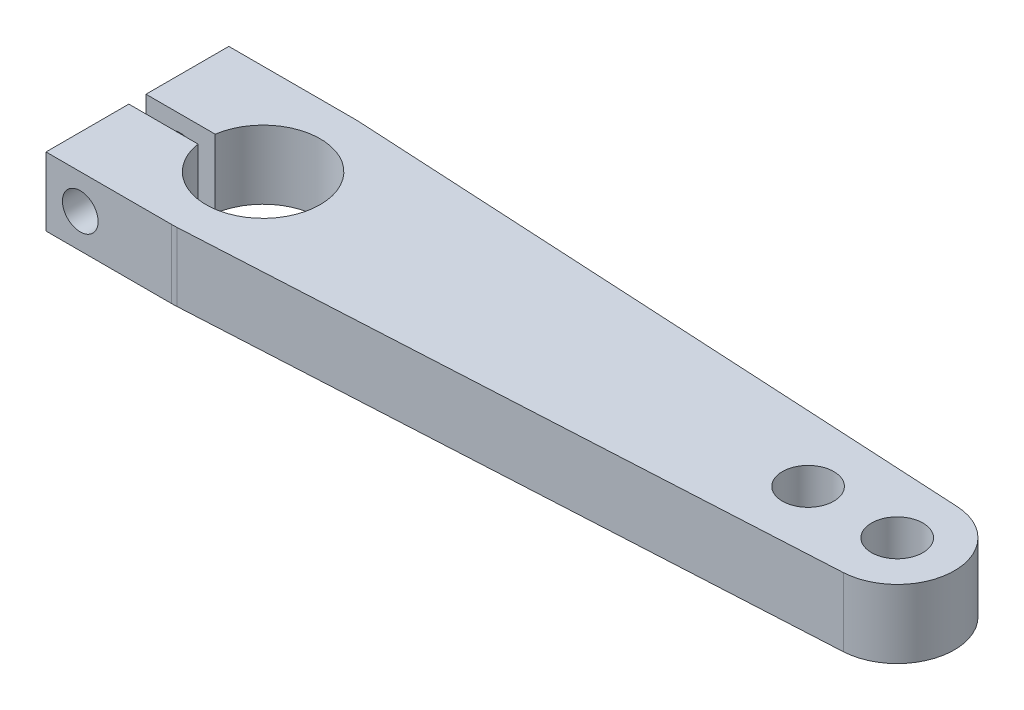
ISO-10303-21;
HEADER;
FILE_DESCRIPTION(('STEP AP214'),'2;1');
FILE_NAME('part.step','',(''),(''),'','','');
FILE_SCHEMA(('AUTOMOTIVE_DESIGN { 1 0 10303 214 1 1 1 1 }'));
ENDSEC;
DATA;
#1=APPLICATION_CONTEXT('core data for automotive mechanical design processes');
#2=APPLICATION_PROTOCOL_DEFINITION('international standard','automotive_design',2000,#1);
#3=PRODUCT_CONTEXT('',#1,'mechanical');
#4=PRODUCT('Part','Part','',(#3));
#5=PRODUCT_RELATED_PRODUCT_CATEGORY('part','',(#4));
#6=PRODUCT_DEFINITION_FORMATION('','',#4);
#7=PRODUCT_DEFINITION_CONTEXT('part definition',#1,'design');
#8=PRODUCT_DEFINITION('design','',#6,#7);
#9=PRODUCT_DEFINITION_SHAPE('','',#8);
#10=(LENGTH_UNIT() NAMED_UNIT(*) SI_UNIT(.MILLI.,.METRE.));
#11=(NAMED_UNIT(*) PLANE_ANGLE_UNIT() SI_UNIT($,.RADIAN.));
#12=(NAMED_UNIT(*) SI_UNIT($,.STERADIAN.) SOLID_ANGLE_UNIT());
#13=UNCERTAINTY_MEASURE_WITH_UNIT(LENGTH_MEASURE(1.E-05),#10,'distance_accuracy_value','');
#14=(GEOMETRIC_REPRESENTATION_CONTEXT(3) GLOBAL_UNCERTAINTY_ASSIGNED_CONTEXT((#13)) GLOBAL_UNIT_ASSIGNED_CONTEXT((#10,
#11,#12)) REPRESENTATION_CONTEXT('',''));
#15=CARTESIAN_POINT('',(0.,0.,0.));
#16=DIRECTION('',(0.,0.,1.));
#17=DIRECTION('',(1.,0.,0.));
#18=AXIS2_PLACEMENT_3D('',#15,#16,#17);
#19=CARTESIAN_POINT('',(-22.,12.,-16.));
#20=DIRECTION('',(1.,0.,0.));
#21=DIRECTION('',(0.,0.,-1.));
#22=AXIS2_PLACEMENT_3D('',#19,#20,#21);
#23=PLANE('',#22);
#24=DIRECTION('',(0.,0.,1.));
#25=VECTOR('',#24,1.);
#26=CARTESIAN_POINT('',(-22.,12.,-16.));
#27=LINE('',#26,#25);
#28=CARTESIAN_POINT('',(-22.,12.,1.5));
#29=VERTEX_POINT('',#28);
#30=CARTESIAN_POINT('',(-22.,12.,16.));
#31=VERTEX_POINT('',#30);
#32=EDGE_CURVE('E152',#29,#31,#27,.T.);
#33=ORIENTED_EDGE('',*,*,#32,.F.);
#34=DIRECTION('',(0.,-1.,0.));
#35=VECTOR('',#34,1.);
#36=CARTESIAN_POINT('',(-22.,12.,1.5));
#37=LINE('',#36,#35);
#38=CARTESIAN_POINT('',(-22.,0.,1.5));
#39=VERTEX_POINT('',#38);
#40=EDGE_CURVE('E145',#29,#39,#37,.T.);
#41=ORIENTED_EDGE('',*,*,#40,.T.);
#42=DIRECTION('',(0.,0.,1.));
#43=VECTOR('',#42,1.);
#44=CARTESIAN_POINT('',(-22.,0.,-16.));
#45=LINE('',#44,#43);
#46=CARTESIAN_POINT('',(-22.,0.,16.));
#47=VERTEX_POINT('',#46);
#48=EDGE_CURVE('E140',#39,#47,#45,.T.);
#49=ORIENTED_EDGE('',*,*,#48,.T.);
#50=DIRECTION('',(0.,-1.,0.));
#51=VECTOR('',#50,1.);
#52=CARTESIAN_POINT('',(-22.,12.,16.));
#53=LINE('',#52,#51);
#54=EDGE_CURVE('E128',#31,#47,#53,.T.);
#55=ORIENTED_EDGE('',*,*,#54,.F.);
#56=EDGE_LOOP('',(#33,#41,#49,#55));
#57=FACE_BOUND('',#56,.T.);
#58=ADVANCED_FACE('F34',(#57),#23,.F.);
#59=CARTESIAN_POINT('',(0.,12.,0.));
#60=DIRECTION('',(0.,1.,0.));
#61=DIRECTION('',(0.,0.,1.));
#62=AXIS2_PLACEMENT_3D('',#59,#60,#61);
#63=PLANE('',#62);
#64=CARTESIAN_POINT('',(95.4,12.,0.));
#65=DIRECTION('',(0.,1.,0.));
#66=DIRECTION('',(0.,0.,1.));
#67=AXIS2_PLACEMENT_3D('',#64,#65,#66);
#68=CIRCLE('',#67,4.5);
#69=CARTESIAN_POINT('',(95.4,12.,4.5));
#70=VERTEX_POINT('',#69);
#71=EDGE_CURVE('E253',#70,#70,#68,.T.);
#72=ORIENTED_EDGE('',*,*,#71,.F.);
#73=EDGE_LOOP('',(#72));
#74=FACE_BOUND('',#73,.T.);
#75=CARTESIAN_POINT('',(111.,12.,0.));
#76=DIRECTION('',(0.,1.,0.));
#77=DIRECTION('',(0.,0.,1.));
#78=AXIS2_PLACEMENT_3D('',#75,#76,#77);
#79=CIRCLE('',#78,4.5);
#80=CARTESIAN_POINT('',(111.,12.,4.5));
#81=VERTEX_POINT('',#80);
#82=EDGE_CURVE('E247',#81,#81,#79,.T.);
#83=ORIENTED_EDGE('',*,*,#82,.F.);
#84=EDGE_LOOP('',(#83));
#85=FACE_BOUND('',#84,.T.);
#86=DIRECTION('',(1.,0.,0.));
#87=VECTOR('',#86,1.);
#88=CARTESIAN_POINT('',(-6.11650233120821,12.,1.5));
#89=LINE('',#88,#87);
#90=CARTESIAN_POINT('',(-9.88685996664259,12.,1.5));
#91=VERTEX_POINT('',#90);
#92=EDGE_CURVE('E57',#29,#91,#89,.T.);
#93=ORIENTED_EDGE('',*,*,#92,.F.);
#94=ORIENTED_EDGE('',*,*,#32,.T.);
#95=DIRECTION('',(1.,0.,0.));
#96=VECTOR('',#95,1.);
#97=CARTESIAN_POINT('',(-22.,12.,16.));
#98=LINE('',#97,#96);
#99=CARTESIAN_POINT('',(0.,12.,16.));
#100=VERTEX_POINT('',#99);
#101=EDGE_CURVE('E151',#31,#100,#98,.T.);
#102=ORIENTED_EDGE('',*,*,#101,.T.);
#103=CARTESIAN_POINT('',(0.,12.,0.));
#104=DIRECTION('',(0.,1.,0.));
#105=DIRECTION('',(0.,0.,1.));
#106=AXIS2_PLACEMENT_3D('',#103,#104,#105);
#107=CIRCLE('',#106,16.);
#108=CARTESIAN_POINT('',(0.864864864864865,12.,15.9766081746259));
#109=VERTEX_POINT('',#108);
#110=EDGE_CURVE('E154',#100,#109,#107,.T.);
#111=ORIENTED_EDGE('',*,*,#110,.T.);
#112=DIRECTION('',(0.998538010914117,0.,-0.054054054054054));
#113=VECTOR('',#112,1.);
#114=CARTESIAN_POINT('',(0.864864864864865,12.,15.9766081746259));
#115=LINE('',#114,#113);
#116=CARTESIAN_POINT('',(111.540540540541,12.,9.98538010914117));
#117=VERTEX_POINT('',#116);
#118=EDGE_CURVE('E156',#109,#117,#115,.T.);
#119=ORIENTED_EDGE('',*,*,#118,.T.);
#120=CARTESIAN_POINT('',(111.,12.,0.));
#121=DIRECTION('',(0.,1.,0.));
#122=DIRECTION('',(0.,0.,1.));
#123=AXIS2_PLACEMENT_3D('',#120,#121,#122);
#124=CIRCLE('',#123,10.);
#125=CARTESIAN_POINT('',(111.540540540541,12.,-9.98538010914118));
#126=VERTEX_POINT('',#125);
#127=EDGE_CURVE('E158',#117,#126,#124,.T.);
#128=ORIENTED_EDGE('',*,*,#127,.T.);
#129=DIRECTION('',(-0.998538010914117,0.,-0.054054054054054));
#130=VECTOR('',#129,1.);
#131=CARTESIAN_POINT('',(0.864864864864865,12.,-15.9766081746259));
#132=LINE('',#131,#130);
#133=CARTESIAN_POINT('',(0.864864864864862,12.,-15.9766081746259));
#134=VERTEX_POINT('',#133);
#135=EDGE_CURVE('E160',#126,#134,#132,.T.);
#136=ORIENTED_EDGE('',*,*,#135,.T.);
#137=CARTESIAN_POINT('',(0.,12.,0.));
#138=DIRECTION('',(0.,1.,0.));
#139=DIRECTION('',(0.,0.,1.));
#140=AXIS2_PLACEMENT_3D('',#137,#138,#139);
#141=CIRCLE('',#140,16.);
#142=CARTESIAN_POINT('',(0.,12.,-16.));
#143=VERTEX_POINT('',#142);
#144=EDGE_CURVE('E162',#134,#143,#141,.T.);
#145=ORIENTED_EDGE('',*,*,#144,.T.);
#146=DIRECTION('',(-1.,0.,0.));
#147=VECTOR('',#146,1.);
#148=CARTESIAN_POINT('',(-22.,12.,-16.));
#149=LINE('',#148,#147);
#150=CARTESIAN_POINT('',(-22.,12.,-16.));
#151=VERTEX_POINT('',#150);
#152=EDGE_CURVE('E164',#143,#151,#149,.T.);
#153=ORIENTED_EDGE('',*,*,#152,.T.);
#154=CARTESIAN_POINT('',(-22.,12.,-1.5));
#155=VERTEX_POINT('',#154);
#156=EDGE_CURVE('E136',#151,#155,#27,.T.);
#157=ORIENTED_EDGE('',*,*,#156,.T.);
#158=DIRECTION('',(-1.,0.,0.));
#159=VECTOR('',#158,1.);
#160=CARTESIAN_POINT('',(-6.11650233120821,12.,-1.5));
#161=LINE('',#160,#159);
#162=CARTESIAN_POINT('',(-9.88685996664259,12.,-1.5));
#163=VERTEX_POINT('',#162);
#164=EDGE_CURVE('E122',#163,#155,#161,.T.);
#165=ORIENTED_EDGE('',*,*,#164,.F.);
#166=CARTESIAN_POINT('',(0.,12.,0.));
#167=DIRECTION('',(0.,1.,0.));
#168=DIRECTION('',(0.,0.,1.));
#169=AXIS2_PLACEMENT_3D('',#166,#167,#168);
#170=CIRCLE('',#169,10.);
#171=EDGE_CURVE('E134',#91,#163,#170,.T.);
#172=ORIENTED_EDGE('',*,*,#171,.F.);
#173=EDGE_LOOP('',(#93,#94,#102,#111,#119,#128,#136,#145,#153,#157,#165,#172));
#174=FACE_BOUND('',#173,.T.);
#175=ADVANCED_FACE('F133',(#74,#85,#174),#63,.T.);
#176=CARTESIAN_POINT('',(0.,0.,0.));
#177=DIRECTION('',(0.,1.,0.));
#178=DIRECTION('',(0.,0.,1.));
#179=AXIS2_PLACEMENT_3D('',#176,#177,#178);
#180=PLANE('',#179);
#181=CARTESIAN_POINT('',(95.4,0.,0.));
#182=DIRECTION('',(0.,1.,0.));
#183=DIRECTION('',(0.,0.,1.));
#184=AXIS2_PLACEMENT_3D('',#181,#182,#183);
#185=CIRCLE('',#184,4.5);
#186=CARTESIAN_POINT('',(95.4,0.,4.5));
#187=VERTEX_POINT('',#186);
#188=EDGE_CURVE('E250',#187,#187,#185,.F.);
#189=ORIENTED_EDGE('',*,*,#188,.F.);
#190=EDGE_LOOP('',(#189));
#191=FACE_BOUND('',#190,.T.);
#192=CARTESIAN_POINT('',(111.,0.,0.));
#193=DIRECTION('',(0.,1.,0.));
#194=DIRECTION('',(0.,0.,1.));
#195=AXIS2_PLACEMENT_3D('',#192,#193,#194);
#196=CIRCLE('',#195,4.5);
#197=CARTESIAN_POINT('',(111.,0.,4.5));
#198=VERTEX_POINT('',#197);
#199=EDGE_CURVE('E242',#198,#198,#196,.F.);
#200=ORIENTED_EDGE('',*,*,#199,.F.);
#201=EDGE_LOOP('',(#200));
#202=FACE_BOUND('',#201,.T.);
#203=ORIENTED_EDGE('',*,*,#48,.F.);
#204=DIRECTION('',(1.,0.,0.));
#205=VECTOR('',#204,1.);
#206=CARTESIAN_POINT('',(-6.11650233120821,0.,1.5));
#207=LINE('',#206,#205);
#208=CARTESIAN_POINT('',(-9.88685996664259,0.,1.5));
#209=VERTEX_POINT('',#208);
#210=EDGE_CURVE('E230',#39,#209,#207,.T.);
#211=ORIENTED_EDGE('',*,*,#210,.T.);
#212=CARTESIAN_POINT('',(0.,0.,0.));
#213=DIRECTION('',(0.,1.,0.));
#214=DIRECTION('',(0.,0.,1.));
#215=AXIS2_PLACEMENT_3D('',#212,#213,#214);
#216=CIRCLE('',#215,10.);
#217=CARTESIAN_POINT('',(-9.88685996664259,0.,-1.5));
#218=VERTEX_POINT('',#217);
#219=EDGE_CURVE('E141',#209,#218,#216,.T.);
#220=ORIENTED_EDGE('',*,*,#219,.T.);
#221=DIRECTION('',(-1.,0.,0.));
#222=VECTOR('',#221,1.);
#223=CARTESIAN_POINT('',(-6.11650233120821,0.,-1.5));
#224=LINE('',#223,#222);
#225=CARTESIAN_POINT('',(-22.,0.,-1.5));
#226=VERTEX_POINT('',#225);
#227=EDGE_CURVE('E50',#218,#226,#224,.T.);
#228=ORIENTED_EDGE('',*,*,#227,.T.);
#229=CARTESIAN_POINT('',(-22.,0.,-16.));
#230=VERTEX_POINT('',#229);
#231=EDGE_CURVE('E143',#230,#226,#45,.T.);
#232=ORIENTED_EDGE('',*,*,#231,.F.);
#233=DIRECTION('',(-1.,0.,0.));
#234=VECTOR('',#233,1.);
#235=CARTESIAN_POINT('',(-22.,0.,-16.));
#236=LINE('',#235,#234);
#237=CARTESIAN_POINT('',(0.,0.,-16.));
#238=VERTEX_POINT('',#237);
#239=EDGE_CURVE('E180',#238,#230,#236,.T.);
#240=ORIENTED_EDGE('',*,*,#239,.F.);
#241=CARTESIAN_POINT('',(0.,0.,0.));
#242=DIRECTION('',(0.,1.,0.));
#243=DIRECTION('',(0.,0.,1.));
#244=AXIS2_PLACEMENT_3D('',#241,#242,#243);
#245=CIRCLE('',#244,16.);
#246=CARTESIAN_POINT('',(0.864864864864862,0.,-15.9766081746259));
#247=VERTEX_POINT('',#246);
#248=EDGE_CURVE('E178',#247,#238,#245,.T.);
#249=ORIENTED_EDGE('',*,*,#248,.F.);
#250=DIRECTION('',(-0.998538010914117,0.,-0.054054054054054));
#251=VECTOR('',#250,1.);
#252=CARTESIAN_POINT('',(0.864864864864865,0.,-15.9766081746259));
#253=LINE('',#252,#251);
#254=CARTESIAN_POINT('',(111.540540540541,0.,-9.98538010914118));
#255=VERTEX_POINT('',#254);
#256=EDGE_CURVE('E176',#255,#247,#253,.T.);
#257=ORIENTED_EDGE('',*,*,#256,.F.);
#258=CARTESIAN_POINT('',(111.,0.,0.));
#259=DIRECTION('',(0.,1.,0.));
#260=DIRECTION('',(0.,0.,1.));
#261=AXIS2_PLACEMENT_3D('',#258,#259,#260);
#262=CIRCLE('',#261,10.);
#263=CARTESIAN_POINT('',(111.540540540541,0.,9.98538010914117));
#264=VERTEX_POINT('',#263);
#265=EDGE_CURVE('E174',#264,#255,#262,.T.);
#266=ORIENTED_EDGE('',*,*,#265,.F.);
#267=DIRECTION('',(0.998538010914117,0.,-0.054054054054054));
#268=VECTOR('',#267,1.);
#269=CARTESIAN_POINT('',(0.864864864864865,0.,15.9766081746259));
#270=LINE('',#269,#268);
#271=CARTESIAN_POINT('',(0.864864864864865,0.,15.9766081746259));
#272=VERTEX_POINT('',#271);
#273=EDGE_CURVE('E172',#272,#264,#270,.T.);
#274=ORIENTED_EDGE('',*,*,#273,.F.);
#275=CARTESIAN_POINT('',(0.,0.,0.));
#276=DIRECTION('',(0.,1.,0.));
#277=DIRECTION('',(0.,0.,1.));
#278=AXIS2_PLACEMENT_3D('',#275,#276,#277);
#279=CIRCLE('',#278,16.);
#280=CARTESIAN_POINT('',(0.,0.,16.));
#281=VERTEX_POINT('',#280);
#282=EDGE_CURVE('E170',#281,#272,#279,.T.);
#283=ORIENTED_EDGE('',*,*,#282,.F.);
#284=DIRECTION('',(1.,0.,0.));
#285=VECTOR('',#284,1.);
#286=CARTESIAN_POINT('',(-22.,0.,16.));
#287=LINE('',#286,#285);
#288=EDGE_CURVE('E168',#47,#281,#287,.T.);
#289=ORIENTED_EDGE('',*,*,#288,.F.);
#290=EDGE_LOOP('',(#203,#211,#220,#228,#232,#240,#249,#257,#266,#274,#283,#289));
#291=FACE_BOUND('',#290,.T.);
#292=ADVANCED_FACE('F216',(#191,#202,#291),#180,.F.);
#293=ORIENTED_EDGE('',*,*,#231,.T.);
#294=DIRECTION('',(0.,1.,0.));
#295=VECTOR('',#294,1.);
#296=CARTESIAN_POINT('',(-22.,12.,-1.5));
#297=LINE('',#296,#295);
#298=EDGE_CURVE('E233',#226,#155,#297,.T.);
#299=ORIENTED_EDGE('',*,*,#298,.T.);
#300=ORIENTED_EDGE('',*,*,#156,.F.);
#301=DIRECTION('',(0.,-1.,0.));
#302=VECTOR('',#301,1.);
#303=CARTESIAN_POINT('',(-22.,12.,-16.));
#304=LINE('',#303,#302);
#305=EDGE_CURVE('E165',#151,#230,#304,.T.);
#306=ORIENTED_EDGE('',*,*,#305,.T.);
#307=EDGE_LOOP('',(#293,#299,#300,#306));
#308=FACE_BOUND('',#307,.T.);
#309=ADVANCED_FACE('F36',(#308),#23,.F.);
#310=CARTESIAN_POINT('',(-22.,12.,16.));
#311=DIRECTION('',(0.,0.,-1.));
#312=DIRECTION('',(-1.,0.,0.));
#313=AXIS2_PLACEMENT_3D('',#310,#311,#312);
#314=PLANE('',#313);
#315=CARTESIAN_POINT('',(-16.,6.,16.));
#316=DIRECTION('',(0.,0.,1.));
#317=DIRECTION('',(1.,0.,0.));
#318=AXIS2_PLACEMENT_3D('',#315,#316,#317);
#319=CIRCLE('',#318,3.125);
#320=CARTESIAN_POINT('',(-12.875,6.,16.));
#321=VERTEX_POINT('',#320);
#322=EDGE_CURVE('E238',#321,#321,#319,.T.);
#323=ORIENTED_EDGE('',*,*,#322,.F.);
#324=EDGE_LOOP('',(#323));
#325=FACE_BOUND('',#324,.T.);
#326=ORIENTED_EDGE('',*,*,#288,.T.);
#327=DIRECTION('',(0.,-1.,0.));
#328=VECTOR('',#327,1.);
#329=CARTESIAN_POINT('',(0.,12.,16.));
#330=LINE('',#329,#328);
#331=EDGE_CURVE('E199',#100,#281,#330,.T.);
#332=ORIENTED_EDGE('',*,*,#331,.F.);
#333=ORIENTED_EDGE('',*,*,#101,.F.);
#334=ORIENTED_EDGE('',*,*,#54,.T.);
#335=EDGE_LOOP('',(#326,#332,#333,#334));
#336=FACE_BOUND('',#335,.T.);
#337=ADVANCED_FACE('F206',(#325,#336),#314,.F.);
#338=CARTESIAN_POINT('',(0.,12.,0.));
#339=DIRECTION('',(0.,-1.,0.));
#340=DIRECTION('',(0.,0.,-1.));
#341=AXIS2_PLACEMENT_3D('',#338,#339,#340);
#342=CYLINDRICAL_SURFACE('',#341,16.);
#343=ORIENTED_EDGE('',*,*,#282,.T.);
#344=DIRECTION('',(0.,-1.,0.));
#345=VECTOR('',#344,1.);
#346=CARTESIAN_POINT('',(0.864864864864865,12.,15.9766081746259));
#347=LINE('',#346,#345);
#348=EDGE_CURVE('E196',#109,#272,#347,.T.);
#349=ORIENTED_EDGE('',*,*,#348,.F.);
#350=ORIENTED_EDGE('',*,*,#110,.F.);
#351=ORIENTED_EDGE('',*,*,#331,.T.);
#352=EDGE_LOOP('',(#343,#349,#350,#351));
#353=FACE_BOUND('',#352,.T.);
#354=ADVANCED_FACE('F221',(#353),#342,.T.);
#355=CARTESIAN_POINT('',(0.864864864864865,12.,15.9766081746259));
#356=DIRECTION('',(-0.054054054054054,0.,-0.998538010914117));
#357=DIRECTION('',(-0.998538010914117,0.,0.054054054054054));
#358=AXIS2_PLACEMENT_3D('',#355,#356,#357);
#359=PLANE('',#358);
#360=ORIENTED_EDGE('',*,*,#273,.T.);
#361=DIRECTION('',(0.,-1.,0.));
#362=VECTOR('',#361,1.);
#363=CARTESIAN_POINT('',(111.540540540541,12.,9.98538010914117));
#364=LINE('',#363,#362);
#365=EDGE_CURVE('E193',#117,#264,#364,.T.);
#366=ORIENTED_EDGE('',*,*,#365,.F.);
#367=ORIENTED_EDGE('',*,*,#118,.F.);
#368=ORIENTED_EDGE('',*,*,#348,.T.);
#369=EDGE_LOOP('',(#360,#366,#367,#368));
#370=FACE_BOUND('',#369,.T.);
#371=ADVANCED_FACE('F225',(#370),#359,.F.);
#372=CARTESIAN_POINT('',(111.,12.,0.));
#373=DIRECTION('',(0.,-1.,0.));
#374=DIRECTION('',(0.,0.,-1.));
#375=AXIS2_PLACEMENT_3D('',#372,#373,#374);
#376=CYLINDRICAL_SURFACE('',#375,10.);
#377=ORIENTED_EDGE('',*,*,#265,.T.);
#378=DIRECTION('',(0.,-1.,0.));
#379=VECTOR('',#378,1.);
#380=CARTESIAN_POINT('',(111.540540540541,12.,-9.98538010914118));
#381=LINE('',#380,#379);
#382=EDGE_CURVE('E190',#126,#255,#381,.T.);
#383=ORIENTED_EDGE('',*,*,#382,.F.);
#384=ORIENTED_EDGE('',*,*,#127,.F.);
#385=ORIENTED_EDGE('',*,*,#365,.T.);
#386=EDGE_LOOP('',(#377,#383,#384,#385));
#387=FACE_BOUND('',#386,.T.);
#388=ADVANCED_FACE('F345',(#387),#376,.T.);
#389=CARTESIAN_POINT('',(0.864864864864865,12.,-15.9766081746259));
#390=DIRECTION('',(-0.054054054054054,0.,0.998538010914117));
#391=DIRECTION('',(0.998538010914117,0.,0.054054054054054));
#392=AXIS2_PLACEMENT_3D('',#389,#390,#391);
#393=PLANE('',#392);
#394=ORIENTED_EDGE('',*,*,#256,.T.);
#395=DIRECTION('',(0.,-1.,0.));
#396=VECTOR('',#395,1.);
#397=CARTESIAN_POINT('',(0.864864864864862,12.,-15.9766081746259));
#398=LINE('',#397,#396);
#399=EDGE_CURVE('E187',#134,#247,#398,.T.);
#400=ORIENTED_EDGE('',*,*,#399,.F.);
#401=ORIENTED_EDGE('',*,*,#135,.F.);
#402=ORIENTED_EDGE('',*,*,#382,.T.);
#403=EDGE_LOOP('',(#394,#400,#401,#402));
#404=FACE_BOUND('',#403,.T.);
#405=ADVANCED_FACE('F338',(#404),#393,.F.);
#406=CARTESIAN_POINT('',(0.,12.,0.));
#407=DIRECTION('',(0.,-1.,0.));
#408=DIRECTION('',(0.,0.,-1.));
#409=AXIS2_PLACEMENT_3D('',#406,#407,#408);
#410=CYLINDRICAL_SURFACE('',#409,16.);
#411=ORIENTED_EDGE('',*,*,#248,.T.);
#412=DIRECTION('',(0.,-1.,0.));
#413=VECTOR('',#412,1.);
#414=CARTESIAN_POINT('',(0.,12.,-16.));
#415=LINE('',#414,#413);
#416=EDGE_CURVE('E184',#143,#238,#415,.T.);
#417=ORIENTED_EDGE('',*,*,#416,.F.);
#418=ORIENTED_EDGE('',*,*,#144,.F.);
#419=ORIENTED_EDGE('',*,*,#399,.T.);
#420=EDGE_LOOP('',(#411,#417,#418,#419));
#421=FACE_BOUND('',#420,.T.);
#422=ADVANCED_FACE('F333',(#421),#410,.T.);
#423=CARTESIAN_POINT('',(-22.,12.,-16.));
#424=DIRECTION('',(0.,0.,1.));
#425=DIRECTION('',(1.,0.,0.));
#426=AXIS2_PLACEMENT_3D('',#423,#424,#425);
#427=PLANE('',#426);
#428=CARTESIAN_POINT('',(-16.,6.,-16.));
#429=DIRECTION('',(0.,0.,1.));
#430=DIRECTION('',(1.,0.,0.));
#431=AXIS2_PLACEMENT_3D('',#428,#429,#430);
#432=CIRCLE('',#431,3.125);
#433=CARTESIAN_POINT('',(-12.875,6.,-16.));
#434=VERTEX_POINT('',#433);
#435=EDGE_CURVE('E241',#434,#434,#432,.T.);
#436=ORIENTED_EDGE('',*,*,#435,.T.);
#437=EDGE_LOOP('',(#436));
#438=FACE_BOUND('',#437,.T.);
#439=ORIENTED_EDGE('',*,*,#239,.T.);
#440=ORIENTED_EDGE('',*,*,#305,.F.);
#441=ORIENTED_EDGE('',*,*,#152,.F.);
#442=ORIENTED_EDGE('',*,*,#416,.T.);
#443=EDGE_LOOP('',(#439,#440,#441,#442));
#444=FACE_BOUND('',#443,.T.);
#445=ADVANCED_FACE('F329',(#438,#444),#427,.F.);
#446=CARTESIAN_POINT('',(0.,12.,0.));
#447=DIRECTION('',(0.,-1.,0.));
#448=DIRECTION('',(0.,0.,-1.));
#449=AXIS2_PLACEMENT_3D('',#446,#447,#448);
#450=CYLINDRICAL_SURFACE('',#449,10.);
#451=DIRECTION('',(0.,-1.,0.));
#452=VECTOR('',#451,1.);
#453=CARTESIAN_POINT('',(-9.88685996664259,12.,1.5));
#454=LINE('',#453,#452);
#455=EDGE_CURVE('E11',#91,#209,#454,.T.);
#456=ORIENTED_EDGE('',*,*,#455,.F.);
#457=ORIENTED_EDGE('',*,*,#171,.T.);
#458=DIRECTION('',(0.,-1.,0.));
#459=VECTOR('',#458,1.);
#460=CARTESIAN_POINT('',(-9.88685996664259,12.,-1.5));
#461=LINE('',#460,#459);
#462=EDGE_CURVE('E43',#218,#163,#461,.F.);
#463=ORIENTED_EDGE('',*,*,#462,.F.);
#464=ORIENTED_EDGE('',*,*,#219,.F.);
#465=EDGE_LOOP('',(#456,#457,#463,#464));
#466=FACE_BOUND('',#465,.T.);
#467=ADVANCED_FACE('F139',(#466),#450,.F.);
#468=CARTESIAN_POINT('',(-6.11650233120821,0.,-1.5));
#469=DIRECTION('',(0.,0.,-1.));
#470=DIRECTION('',(-1.,0.,0.));
#471=AXIS2_PLACEMENT_3D('',#468,#469,#470);
#472=PLANE('',#471);
#473=CARTESIAN_POINT('',(-16.,6.,-1.5));
#474=DIRECTION('',(0.,0.,-1.));
#475=DIRECTION('',(-1.,0.,0.));
#476=AXIS2_PLACEMENT_3D('',#473,#474,#475);
#477=CIRCLE('',#476,3.125);
#478=CARTESIAN_POINT('',(-19.125,6.,-1.5));
#479=VERTEX_POINT('',#478);
#480=EDGE_CURVE('E137',#479,#479,#477,.T.);
#481=ORIENTED_EDGE('',*,*,#480,.T.);
#482=EDGE_LOOP('',(#481));
#483=FACE_BOUND('',#482,.T.);
#484=ORIENTED_EDGE('',*,*,#227,.F.);
#485=ORIENTED_EDGE('',*,*,#462,.T.);
#486=ORIENTED_EDGE('',*,*,#164,.T.);
#487=ORIENTED_EDGE('',*,*,#298,.F.);
#488=EDGE_LOOP('',(#484,#485,#486,#487));
#489=FACE_BOUND('',#488,.T.);
#490=ADVANCED_FACE('F121',(#483,#489),#472,.F.);
#491=CARTESIAN_POINT('',(-6.11650233120821,0.,1.5));
#492=DIRECTION('',(0.,0.,1.));
#493=DIRECTION('',(1.,0.,0.));
#494=AXIS2_PLACEMENT_3D('',#491,#492,#493);
#495=PLANE('',#494);
#496=CARTESIAN_POINT('',(-16.,6.,1.5));
#497=DIRECTION('',(0.,0.,1.));
#498=DIRECTION('',(1.,0.,0.));
#499=AXIS2_PLACEMENT_3D('',#496,#497,#498);
#500=CIRCLE('',#499,3.125);
#501=CARTESIAN_POINT('',(-12.875,6.,1.5));
#502=VERTEX_POINT('',#501);
#503=EDGE_CURVE('E38',#502,#502,#500,.T.);
#504=ORIENTED_EDGE('',*,*,#503,.T.);
#505=EDGE_LOOP('',(#504));
#506=FACE_BOUND('',#505,.T.);
#507=ORIENTED_EDGE('',*,*,#92,.T.);
#508=ORIENTED_EDGE('',*,*,#455,.T.);
#509=ORIENTED_EDGE('',*,*,#210,.F.);
#510=ORIENTED_EDGE('',*,*,#40,.F.);
#511=EDGE_LOOP('',(#507,#508,#509,#510));
#512=FACE_BOUND('',#511,.T.);
#513=ADVANCED_FACE('F321',(#506,#512),#495,.F.);
#514=CARTESIAN_POINT('',(-16.,6.,-16.));
#515=DIRECTION('',(0.,0.,1.));
#516=DIRECTION('',(1.,0.,0.));
#517=AXIS2_PLACEMENT_3D('',#514,#515,#516);
#518=CYLINDRICAL_SURFACE('',#517,3.125);
#519=ORIENTED_EDGE('',*,*,#322,.T.);
#520=EDGE_LOOP('',(#519));
#521=FACE_BOUND('',#520,.T.);
#522=ORIENTED_EDGE('',*,*,#503,.F.);
#523=EDGE_LOOP('',(#522));
#524=FACE_BOUND('',#523,.T.);
#525=ADVANCED_FACE('F319',(#521,#524),#518,.F.);
#526=ORIENTED_EDGE('',*,*,#435,.F.);
#527=EDGE_LOOP('',(#526));
#528=FACE_BOUND('',#527,.T.);
#529=ORIENTED_EDGE('',*,*,#480,.F.);
#530=EDGE_LOOP('',(#529));
#531=FACE_BOUND('',#530,.T.);
#532=ADVANCED_FACE('F268',(#528,#531),#518,.F.);
#533=CARTESIAN_POINT('',(111.,-0.000999999999999265,0.));
#534=DIRECTION('',(0.,1.,0.));
#535=DIRECTION('',(0.,0.,1.));
#536=AXIS2_PLACEMENT_3D('',#533,#534,#535);
#537=CYLINDRICAL_SURFACE('',#536,4.5);
#538=ORIENTED_EDGE('',*,*,#82,.T.);
#539=EDGE_LOOP('',(#538));
#540=FACE_BOUND('',#539,.T.);
#541=ORIENTED_EDGE('',*,*,#199,.T.);
#542=EDGE_LOOP('',(#541));
#543=FACE_BOUND('',#542,.T.);
#544=ADVANCED_FACE('F265',(#540,#543),#537,.F.);
#545=CARTESIAN_POINT('',(95.4,-0.000999999999999265,0.));
#546=DIRECTION('',(0.,1.,0.));
#547=DIRECTION('',(0.,0.,1.));
#548=AXIS2_PLACEMENT_3D('',#545,#546,#547);
#549=CYLINDRICAL_SURFACE('',#548,4.5);
#550=ORIENTED_EDGE('',*,*,#71,.T.);
#551=EDGE_LOOP('',(#550));
#552=FACE_BOUND('',#551,.T.);
#553=ORIENTED_EDGE('',*,*,#188,.T.);
#554=EDGE_LOOP('',(#553));
#555=FACE_BOUND('',#554,.T.);
#556=ADVANCED_FACE('F257',(#552,#555),#549,.F.);
#557=CLOSED_SHELL('',(#58,#175,#292,#309,#337,#354,#371,#388,#405,#422,#445,#467,#490,#513,#525,
#532,#544,#556));
#558=MANIFOLD_SOLID_BREP('B2',#557);
#559=ADVANCED_BREP_SHAPE_REPRESENTATION('',(#18,#558),#14);
#560=SHAPE_DEFINITION_REPRESENTATION(#9,#559);
ENDSEC;
END-ISO-10303-21;
